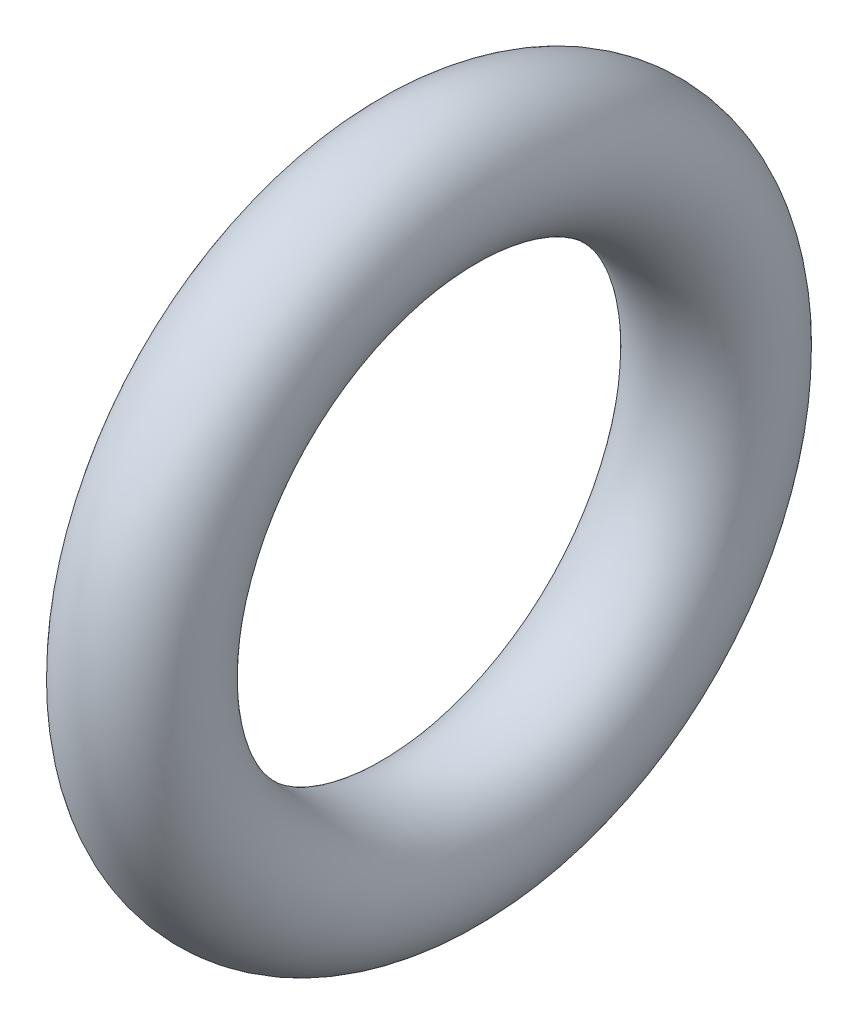
ISO-10303-21;
HEADER;
FILE_DESCRIPTION(('STEP AP214'),'2;1');
FILE_NAME('part.step','',(''),(''),'','','');
FILE_SCHEMA(('AUTOMOTIVE_DESIGN { 1 0 10303 214 1 1 1 1 }'));
ENDSEC;
DATA;
#1=APPLICATION_CONTEXT('core data for automotive mechanical design processes');
#2=APPLICATION_PROTOCOL_DEFINITION('international standard','automotive_design',2000,#1);
#3=PRODUCT_CONTEXT('',#1,'mechanical');
#4=PRODUCT('Part','Part','',(#3));
#5=PRODUCT_RELATED_PRODUCT_CATEGORY('part','',(#4));
#6=PRODUCT_DEFINITION_FORMATION('','',#4);
#7=PRODUCT_DEFINITION_CONTEXT('part definition',#1,'design');
#8=PRODUCT_DEFINITION('design','',#6,#7);
#9=PRODUCT_DEFINITION_SHAPE('','',#8);
#10=(LENGTH_UNIT() NAMED_UNIT(*) SI_UNIT(.MILLI.,.METRE.));
#11=(NAMED_UNIT(*) PLANE_ANGLE_UNIT() SI_UNIT($,.RADIAN.));
#12=(NAMED_UNIT(*) SI_UNIT($,.STERADIAN.) SOLID_ANGLE_UNIT());
#13=UNCERTAINTY_MEASURE_WITH_UNIT(LENGTH_MEASURE(1.E-05),#10,'distance_accuracy_value','');
#14=(GEOMETRIC_REPRESENTATION_CONTEXT(3) GLOBAL_UNCERTAINTY_ASSIGNED_CONTEXT((#13)) GLOBAL_UNIT_ASSIGNED_CONTEXT((#10,
#11,#12)) REPRESENTATION_CONTEXT('',''));
#15=CARTESIAN_POINT('',(0.,0.,0.));
#16=DIRECTION('',(0.,0.,1.));
#17=DIRECTION('',(1.,0.,0.));
#18=AXIS2_PLACEMENT_3D('',#15,#16,#17);
#19=CARTESIAN_POINT('',(6.,0.,0.));
#20=DIRECTION('',(1.,0.,0.));
#21=DIRECTION('',(0.,0.,-1.));
#22=AXIS2_PLACEMENT_3D('',#19,#20,#21);
#23=TOROIDAL_SURFACE('',#22,3.5625,0.8375);
#24=CARTESIAN_POINT('',(6.,0.,-4.4));
#25=VERTEX_POINT('',#24);
#26=VERTEX_LOOP('',#25);
#27=FACE_BOUND('',#26,.T.);
#28=ADVANCED_FACE('F30',(#27),#23,.T.);
#29=CLOSED_SHELL('',(#28));
#30=MANIFOLD_SOLID_BREP('B2',#29);
#31=ADVANCED_BREP_SHAPE_REPRESENTATION('',(#18,#30),#14);
#32=SHAPE_DEFINITION_REPRESENTATION(#9,#31);
ENDSEC;
END-ISO-10303-21;
